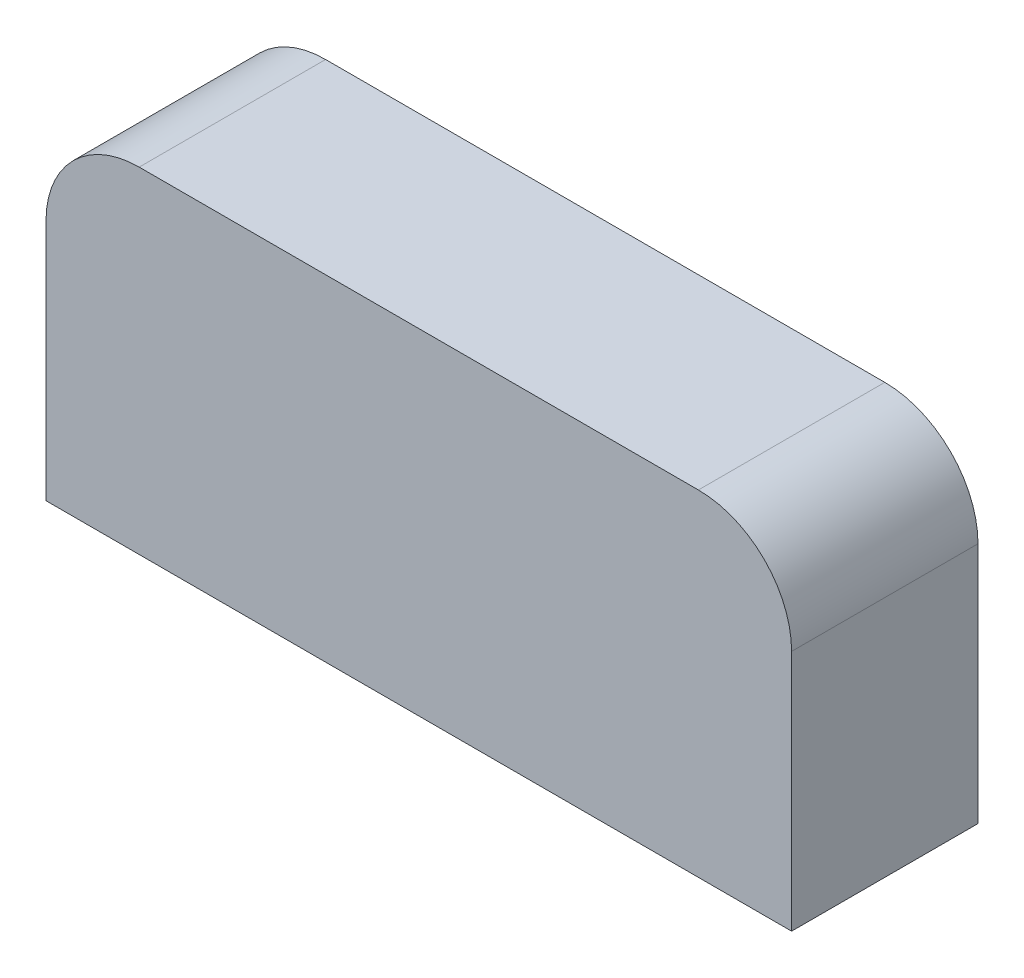
ISO-10303-21;
HEADER;
FILE_DESCRIPTION(('STEP AP214'),'2;1');
FILE_NAME('part.step','',(''),(''),'','','');
FILE_SCHEMA(('AUTOMOTIVE_DESIGN { 1 0 10303 214 1 1 1 1 }'));
ENDSEC;
DATA;
#1=APPLICATION_CONTEXT('core data for automotive mechanical design processes');
#2=APPLICATION_PROTOCOL_DEFINITION('international standard','automotive_design',2000,#1);
#3=PRODUCT_CONTEXT('',#1,'mechanical');
#4=PRODUCT('Part','Part','',(#3));
#5=PRODUCT_RELATED_PRODUCT_CATEGORY('part','',(#4));
#6=PRODUCT_DEFINITION_FORMATION('','',#4);
#7=PRODUCT_DEFINITION_CONTEXT('part definition',#1,'design');
#8=PRODUCT_DEFINITION('design','',#6,#7);
#9=PRODUCT_DEFINITION_SHAPE('','',#8);
#10=(LENGTH_UNIT() NAMED_UNIT(*) SI_UNIT(.MILLI.,.METRE.));
#11=(NAMED_UNIT(*) PLANE_ANGLE_UNIT() SI_UNIT($,.RADIAN.));
#12=(NAMED_UNIT(*) SI_UNIT($,.STERADIAN.) SOLID_ANGLE_UNIT());
#13=UNCERTAINTY_MEASURE_WITH_UNIT(LENGTH_MEASURE(1.E-05),#10,'distance_accuracy_value','');
#14=(GEOMETRIC_REPRESENTATION_CONTEXT(3) GLOBAL_UNCERTAINTY_ASSIGNED_CONTEXT((#13)) GLOBAL_UNIT_ASSIGNED_CONTEXT((#10,
#11,#12)) REPRESENTATION_CONTEXT('',''));
#15=CARTESIAN_POINT('',(0.,0.,0.));
#16=DIRECTION('',(0.,0.,1.));
#17=DIRECTION('',(1.,0.,0.));
#18=AXIS2_PLACEMENT_3D('',#15,#16,#17);
#19=CARTESIAN_POINT('',(0.,0.,-25.4));
#20=DIRECTION('',(0.,0.,1.));
#21=DIRECTION('',(1.,0.,0.));
#22=AXIS2_PLACEMENT_3D('',#19,#20,#21);
#23=PLANE('',#22);
#24=DIRECTION('',(1.,0.,0.));
#25=VECTOR('',#24,1.);
#26=CARTESIAN_POINT('',(50.8,47.625,-25.4));
#27=LINE('',#26,#25);
#28=CARTESIAN_POINT('',(-38.1,47.625,-25.4));
#29=VERTEX_POINT('',#28);
#30=CARTESIAN_POINT('',(38.1,47.625,-25.4));
#31=VERTEX_POINT('',#30);
#32=EDGE_CURVE('E199',#29,#31,#27,.T.);
#33=ORIENTED_EDGE('',*,*,#32,.F.);
#34=CARTESIAN_POINT('',(-38.1,38.1,-25.4));
#35=DIRECTION('',(0.,0.,1.));
#36=DIRECTION('',(1.,0.,0.));
#37=AXIS2_PLACEMENT_3D('',#34,#35,#36);
#38=CIRCLE('',#37,9.525);
#39=CARTESIAN_POINT('',(-47.625,38.1,-25.4));
#40=VERTEX_POINT('',#39);
#41=EDGE_CURVE('E192',#40,#29,#38,.F.);
#42=ORIENTED_EDGE('',*,*,#41,.F.);
#43=DIRECTION('',(0.,1.,0.));
#44=VECTOR('',#43,1.);
#45=CARTESIAN_POINT('',(-47.625,-50.8,-25.4));
#46=LINE('',#45,#44);
#47=CARTESIAN_POINT('',(-47.625,8.25500000000002,-25.4));
#48=VERTEX_POINT('',#47);
#49=EDGE_CURVE('E193',#48,#40,#46,.T.);
#50=ORIENTED_EDGE('',*,*,#49,.F.);
#51=DIRECTION('',(1.,0.,0.));
#52=VECTOR('',#51,1.);
#53=CARTESIAN_POINT('',(-50.810023925187,8.25500000000002,-25.4));
#54=LINE('',#53,#52);
#55=CARTESIAN_POINT('',(47.625,8.25500000000002,-25.4));
#56=VERTEX_POINT('',#55);
#57=EDGE_CURVE('E149',#48,#56,#54,.T.);
#58=ORIENTED_EDGE('',*,*,#57,.T.);
#59=DIRECTION('',(0.,-1.,0.));
#60=VECTOR('',#59,1.);
#61=CARTESIAN_POINT('',(47.625,-50.8,-25.4));
#62=LINE('',#61,#60);
#63=CARTESIAN_POINT('',(47.625,38.1,-25.4));
#64=VERTEX_POINT('',#63);
#65=EDGE_CURVE('E145',#64,#56,#62,.T.);
#66=ORIENTED_EDGE('',*,*,#65,.F.);
#67=CARTESIAN_POINT('',(38.1,38.1,-25.4));
#68=DIRECTION('',(0.,0.,1.));
#69=DIRECTION('',(1.,0.,0.));
#70=AXIS2_PLACEMENT_3D('',#67,#68,#69);
#71=CIRCLE('',#70,9.525);
#72=EDGE_CURVE('E202',#31,#64,#71,.F.);
#73=ORIENTED_EDGE('',*,*,#72,.F.);
#74=EDGE_LOOP('',(#33,#42,#50,#58,#66,#73));
#75=FACE_BOUND('',#74,.T.);
#76=DIRECTION('',(1.,0.,0.));
#77=VECTOR('',#76,1.);
#78=CARTESIAN_POINT('',(50.8,50.8,-25.4));
#79=LINE('',#78,#77);
#80=CARTESIAN_POINT('',(-38.1,50.8,-25.4));
#81=VERTEX_POINT('',#80);
#82=CARTESIAN_POINT('',(38.1,50.8,-25.4));
#83=VERTEX_POINT('',#82);
#84=EDGE_CURVE('E49',#81,#83,#79,.T.);
#85=ORIENTED_EDGE('',*,*,#84,.T.);
#86=CARTESIAN_POINT('',(38.1,38.1,-25.4));
#87=DIRECTION('',(0.,0.,1.));
#88=DIRECTION('',(1.,0.,0.));
#89=AXIS2_PLACEMENT_3D('',#86,#87,#88);
#90=CIRCLE('',#89,12.7);
#91=CARTESIAN_POINT('',(50.8,38.1,-25.4));
#92=VERTEX_POINT('',#91);
#93=EDGE_CURVE('E254',#83,#92,#90,.F.);
#94=ORIENTED_EDGE('',*,*,#93,.T.);
#95=DIRECTION('',(0.,-1.,0.));
#96=VECTOR('',#95,1.);
#97=CARTESIAN_POINT('',(50.8,-50.8,-25.4));
#98=LINE('',#97,#96);
#99=CARTESIAN_POINT('',(50.8,5.08000000000002,-25.4));
#100=VERTEX_POINT('',#99);
#101=EDGE_CURVE('E55',#92,#100,#98,.T.);
#102=ORIENTED_EDGE('',*,*,#101,.T.);
#103=DIRECTION('',(1.,0.,0.));
#104=VECTOR('',#103,1.);
#105=CARTESIAN_POINT('',(-50.810023925187,5.08000000000002,-25.4));
#106=LINE('',#105,#104);
#107=CARTESIAN_POINT('',(-50.8,5.08000000000002,-25.4));
#108=VERTEX_POINT('',#107);
#109=EDGE_CURVE('E245',#108,#100,#106,.T.);
#110=ORIENTED_EDGE('',*,*,#109,.F.);
#111=DIRECTION('',(0.,1.,0.));
#112=VECTOR('',#111,1.);
#113=CARTESIAN_POINT('',(-50.8,-50.8,-25.4));
#114=LINE('',#113,#112);
#115=CARTESIAN_POINT('',(-50.8,38.1,-25.4));
#116=VERTEX_POINT('',#115);
#117=EDGE_CURVE('E11',#108,#116,#114,.T.);
#118=ORIENTED_EDGE('',*,*,#117,.T.);
#119=CARTESIAN_POINT('',(-38.1,38.1,-25.4));
#120=DIRECTION('',(0.,0.,1.));
#121=DIRECTION('',(1.,0.,0.));
#122=AXIS2_PLACEMENT_3D('',#119,#120,#121);
#123=CIRCLE('',#122,12.7);
#124=EDGE_CURVE('E247',#116,#81,#123,.F.);
#125=ORIENTED_EDGE('',*,*,#124,.T.);
#126=EDGE_LOOP('',(#85,#94,#102,#110,#118,#125));
#127=FACE_BOUND('',#126,.T.);
#128=ADVANCED_FACE('F46',(#75,#127),#23,.F.);
#129=CARTESIAN_POINT('',(-50.810023925187,5.08000000000002,0.));
#130=DIRECTION('',(0.,1.,0.));
#131=DIRECTION('',(0.,0.,1.));
#132=AXIS2_PLACEMENT_3D('',#129,#130,#131);
#133=PLANE('',#132);
#134=DIRECTION('',(0.,0.,-1.));
#135=VECTOR('',#134,1.);
#136=CARTESIAN_POINT('',(-50.8,5.08000000000002,-381.1016));
#137=LINE('',#136,#135);
#138=CARTESIAN_POINT('',(-50.8,5.08000000000002,0.));
#139=VERTEX_POINT('',#138);
#140=EDGE_CURVE('E246',#139,#108,#137,.T.);
#141=ORIENTED_EDGE('',*,*,#140,.T.);
#142=ORIENTED_EDGE('',*,*,#109,.T.);
#143=DIRECTION('',(0.,0.,1.));
#144=VECTOR('',#143,1.);
#145=CARTESIAN_POINT('',(50.8,5.08000000000002,-381.1016));
#146=LINE('',#145,#144);
#147=CARTESIAN_POINT('',(50.8,5.08000000000002,0.));
#148=VERTEX_POINT('',#147);
#149=EDGE_CURVE('E242',#100,#148,#146,.T.);
#150=ORIENTED_EDGE('',*,*,#149,.T.);
#151=DIRECTION('',(1.,0.,0.));
#152=VECTOR('',#151,1.);
#153=CARTESIAN_POINT('',(-50.810023925187,5.08000000000002,0.));
#154=LINE('',#153,#152);
#155=EDGE_CURVE('E237',#139,#148,#154,.T.);
#156=ORIENTED_EDGE('',*,*,#155,.F.);
#157=EDGE_LOOP('',(#141,#142,#150,#156));
#158=FACE_BOUND('',#157,.T.);
#159=ADVANCED_FACE('F282',(#158),#133,.F.);
#160=CARTESIAN_POINT('',(-38.1,38.1,-381.1016));
#161=DIRECTION('',(0.,0.,1.));
#162=DIRECTION('',(1.,0.,0.));
#163=AXIS2_PLACEMENT_3D('',#160,#161,#162);
#164=CYLINDRICAL_SURFACE('',#163,12.7);
#165=ORIENTED_EDGE('',*,*,#124,.F.);
#166=DIRECTION('',(0.,0.,1.));
#167=VECTOR('',#166,1.);
#168=CARTESIAN_POINT('',(-50.8,38.1,-381.1016));
#169=LINE('',#168,#167);
#170=CARTESIAN_POINT('',(-50.8,38.1,0.));
#171=VERTEX_POINT('',#170);
#172=EDGE_CURVE('E218',#171,#116,#169,.F.);
#173=ORIENTED_EDGE('',*,*,#172,.F.);
#174=CARTESIAN_POINT('',(-38.1,38.1,0.));
#175=DIRECTION('',(0.,0.,1.));
#176=DIRECTION('',(1.,0.,0.));
#177=AXIS2_PLACEMENT_3D('',#174,#175,#176);
#178=CIRCLE('',#177,12.7);
#179=CARTESIAN_POINT('',(-38.1,50.8,0.));
#180=VERTEX_POINT('',#179);
#181=EDGE_CURVE('E224',#180,#171,#178,.T.);
#182=ORIENTED_EDGE('',*,*,#181,.F.);
#183=DIRECTION('',(0.,0.,1.));
#184=VECTOR('',#183,1.);
#185=CARTESIAN_POINT('',(-38.1,50.8,-381.1016));
#186=LINE('',#185,#184);
#187=EDGE_CURVE('E231',#81,#180,#186,.T.);
#188=ORIENTED_EDGE('',*,*,#187,.F.);
#189=EDGE_LOOP('',(#165,#173,#182,#188));
#190=FACE_BOUND('',#189,.T.);
#191=ADVANCED_FACE('F287',(#190),#164,.T.);
#192=CARTESIAN_POINT('',(50.8,50.8,-381.1016));
#193=DIRECTION('',(0.,1.,0.));
#194=DIRECTION('',(-1.,0.,0.));
#195=AXIS2_PLACEMENT_3D('',#192,#193,#194);
#196=PLANE('',#195);
#197=ORIENTED_EDGE('',*,*,#84,.F.);
#198=ORIENTED_EDGE('',*,*,#187,.T.);
#199=DIRECTION('',(-1.,0.,0.));
#200=VECTOR('',#199,1.);
#201=CARTESIAN_POINT('',(50.8,50.8,0.));
#202=LINE('',#201,#200);
#203=CARTESIAN_POINT('',(38.1,50.8,0.));
#204=VERTEX_POINT('',#203);
#205=EDGE_CURVE('E214',#204,#180,#202,.T.);
#206=ORIENTED_EDGE('',*,*,#205,.F.);
#207=DIRECTION('',(0.,0.,1.));
#208=VECTOR('',#207,1.);
#209=CARTESIAN_POINT('',(38.1,50.8,-381.1016));
#210=LINE('',#209,#208);
#211=EDGE_CURVE('E227',#204,#83,#210,.F.);
#212=ORIENTED_EDGE('',*,*,#211,.T.);
#213=EDGE_LOOP('',(#197,#198,#206,#212));
#214=FACE_BOUND('',#213,.T.);
#215=ADVANCED_FACE('F266',(#214),#196,.T.);
#216=CARTESIAN_POINT('',(38.1,38.1,-381.1016));
#217=DIRECTION('',(0.,0.,1.));
#218=DIRECTION('',(1.,0.,0.));
#219=AXIS2_PLACEMENT_3D('',#216,#217,#218);
#220=CYLINDRICAL_SURFACE('',#219,12.7);
#221=ORIENTED_EDGE('',*,*,#93,.F.);
#222=ORIENTED_EDGE('',*,*,#211,.F.);
#223=CARTESIAN_POINT('',(38.1,38.1,0.));
#224=DIRECTION('',(0.,0.,1.));
#225=DIRECTION('',(1.,0.,0.));
#226=AXIS2_PLACEMENT_3D('',#223,#224,#225);
#227=CIRCLE('',#226,12.7);
#228=CARTESIAN_POINT('',(50.8,38.1,0.));
#229=VERTEX_POINT('',#228);
#230=EDGE_CURVE('E221',#229,#204,#227,.T.);
#231=ORIENTED_EDGE('',*,*,#230,.F.);
#232=DIRECTION('',(0.,0.,1.));
#233=VECTOR('',#232,1.);
#234=CARTESIAN_POINT('',(50.8,38.1,-381.1016));
#235=LINE('',#234,#233);
#236=EDGE_CURVE('E234',#92,#229,#235,.T.);
#237=ORIENTED_EDGE('',*,*,#236,.F.);
#238=EDGE_LOOP('',(#221,#222,#231,#237));
#239=FACE_BOUND('',#238,.T.);
#240=ADVANCED_FACE('F269',(#239),#220,.T.);
#241=CARTESIAN_POINT('',(50.8,-50.8,-381.1016));
#242=DIRECTION('',(1.,0.,0.));
#243=DIRECTION('',(0.,0.,-1.));
#244=AXIS2_PLACEMENT_3D('',#241,#242,#243);
#245=PLANE('',#244);
#246=ORIENTED_EDGE('',*,*,#101,.F.);
#247=ORIENTED_EDGE('',*,*,#236,.T.);
#248=DIRECTION('',(0.,1.,0.));
#249=VECTOR('',#248,1.);
#250=CARTESIAN_POINT('',(50.8,-50.8,0.));
#251=LINE('',#250,#249);
#252=EDGE_CURVE('E210',#148,#229,#251,.T.);
#253=ORIENTED_EDGE('',*,*,#252,.F.);
#254=ORIENTED_EDGE('',*,*,#149,.F.);
#255=EDGE_LOOP('',(#246,#247,#253,#254));
#256=FACE_BOUND('',#255,.T.);
#257=ADVANCED_FACE('F272',(#256),#245,.T.);
#258=CARTESIAN_POINT('',(-50.8,-50.8,-381.1016));
#259=DIRECTION('',(-1.,0.,0.));
#260=DIRECTION('',(0.,0.,1.));
#261=AXIS2_PLACEMENT_3D('',#258,#259,#260);
#262=PLANE('',#261);
#263=ORIENTED_EDGE('',*,*,#117,.F.);
#264=ORIENTED_EDGE('',*,*,#140,.F.);
#265=DIRECTION('',(0.,-1.,0.));
#266=VECTOR('',#265,1.);
#267=CARTESIAN_POINT('',(-50.8,-50.8,0.));
#268=LINE('',#267,#266);
#269=EDGE_CURVE('E196',#171,#139,#268,.T.);
#270=ORIENTED_EDGE('',*,*,#269,.F.);
#271=ORIENTED_EDGE('',*,*,#172,.T.);
#272=EDGE_LOOP('',(#263,#264,#270,#271));
#273=FACE_BOUND('',#272,.T.);
#274=ADVANCED_FACE('F283',(#273),#262,.T.);
#275=CARTESIAN_POINT('',(0.,0.,0.));
#276=DIRECTION('',(0.,0.,1.));
#277=DIRECTION('',(1.,0.,0.));
#278=AXIS2_PLACEMENT_3D('',#275,#276,#277);
#279=PLANE('',#278);
#280=ORIENTED_EDGE('',*,*,#269,.T.);
#281=ORIENTED_EDGE('',*,*,#155,.T.);
#282=ORIENTED_EDGE('',*,*,#252,.T.);
#283=ORIENTED_EDGE('',*,*,#230,.T.);
#284=ORIENTED_EDGE('',*,*,#205,.T.);
#285=ORIENTED_EDGE('',*,*,#181,.T.);
#286=EDGE_LOOP('',(#280,#281,#282,#283,#284,#285));
#287=FACE_BOUND('',#286,.T.);
#288=ADVANCED_FACE('F276',(#287),#279,.T.);
#289=CARTESIAN_POINT('',(-50.810023925187,8.25500000000002,0.));
#290=DIRECTION('',(0.,1.,0.));
#291=DIRECTION('',(0.,0.,1.));
#292=AXIS2_PLACEMENT_3D('',#289,#290,#291);
#293=PLANE('',#292);
#294=DIRECTION('',(0.,0.,-1.));
#295=VECTOR('',#294,1.);
#296=CARTESIAN_POINT('',(-47.625,8.25500000000003,-381.1016));
#297=LINE('',#296,#295);
#298=CARTESIAN_POINT('',(-47.625,8.25500000000002,-3.175));
#299=VERTEX_POINT('',#298);
#300=EDGE_CURVE('E150',#299,#48,#297,.T.);
#301=ORIENTED_EDGE('',*,*,#300,.F.);
#302=DIRECTION('',(1.,0.,0.));
#303=VECTOR('',#302,1.);
#304=CARTESIAN_POINT('',(-50.810023925187,8.25500000000002,-3.175));
#305=LINE('',#304,#303);
#306=CARTESIAN_POINT('',(47.625,8.25500000000002,-3.175));
#307=VERTEX_POINT('',#306);
#308=EDGE_CURVE('E153',#299,#307,#305,.T.);
#309=ORIENTED_EDGE('',*,*,#308,.T.);
#310=DIRECTION('',(0.,0.,1.));
#311=VECTOR('',#310,1.);
#312=CARTESIAN_POINT('',(47.625,8.25500000000003,-381.1016));
#313=LINE('',#312,#311);
#314=EDGE_CURVE('E137',#56,#307,#313,.T.);
#315=ORIENTED_EDGE('',*,*,#314,.F.);
#316=ORIENTED_EDGE('',*,*,#57,.F.);
#317=EDGE_LOOP('',(#301,#309,#315,#316));
#318=FACE_BOUND('',#317,.T.);
#319=ADVANCED_FACE('F154',(#318),#293,.T.);
#320=CARTESIAN_POINT('',(-38.1,38.1,-381.1016));
#321=DIRECTION('',(0.,0.,1.));
#322=DIRECTION('',(1.,0.,0.));
#323=AXIS2_PLACEMENT_3D('',#320,#321,#322);
#324=CYLINDRICAL_SURFACE('',#323,9.525);
#325=ORIENTED_EDGE('',*,*,#41,.T.);
#326=DIRECTION('',(0.,0.,1.));
#327=VECTOR('',#326,1.);
#328=CARTESIAN_POINT('',(-38.1,47.625,-381.1016));
#329=LINE('',#328,#327);
#330=CARTESIAN_POINT('',(-38.1,47.625,-3.17499999999998));
#331=VERTEX_POINT('',#330);
#332=EDGE_CURVE('E180',#29,#331,#329,.T.);
#333=ORIENTED_EDGE('',*,*,#332,.T.);
#334=CARTESIAN_POINT('',(-38.1,38.1,-3.17499999999998));
#335=DIRECTION('',(0.,0.,1.));
#336=DIRECTION('',(1.,0.,0.));
#337=AXIS2_PLACEMENT_3D('',#334,#335,#336);
#338=CIRCLE('',#337,9.525);
#339=CARTESIAN_POINT('',(-47.625,38.1,-3.17499999999998));
#340=VERTEX_POINT('',#339);
#341=EDGE_CURVE('E181',#331,#340,#338,.T.);
#342=ORIENTED_EDGE('',*,*,#341,.T.);
#343=DIRECTION('',(0.,0.,1.));
#344=VECTOR('',#343,1.);
#345=CARTESIAN_POINT('',(-47.625,38.1,-381.1016));
#346=LINE('',#345,#344);
#347=EDGE_CURVE('E63',#340,#40,#346,.F.);
#348=ORIENTED_EDGE('',*,*,#347,.T.);
#349=EDGE_LOOP('',(#325,#333,#342,#348));
#350=FACE_BOUND('',#349,.T.);
#351=ADVANCED_FACE('F297',(#350),#324,.F.);
#352=CARTESIAN_POINT('',(50.8,47.625,-381.1016));
#353=DIRECTION('',(0.,1.,0.));
#354=DIRECTION('',(-1.,0.,0.));
#355=AXIS2_PLACEMENT_3D('',#352,#353,#354);
#356=PLANE('',#355);
#357=ORIENTED_EDGE('',*,*,#32,.T.);
#358=DIRECTION('',(0.,0.,1.));
#359=VECTOR('',#358,1.);
#360=CARTESIAN_POINT('',(38.1,47.625,-381.1016));
#361=LINE('',#360,#359);
#362=CARTESIAN_POINT('',(38.1,47.625,-3.17499999999998));
#363=VERTEX_POINT('',#362);
#364=EDGE_CURVE('E176',#363,#31,#361,.F.);
#365=ORIENTED_EDGE('',*,*,#364,.F.);
#366=DIRECTION('',(-1.,0.,0.));
#367=VECTOR('',#366,1.);
#368=CARTESIAN_POINT('',(0.,47.625,-3.175));
#369=LINE('',#368,#367);
#370=EDGE_CURVE('E166',#363,#331,#369,.T.);
#371=ORIENTED_EDGE('',*,*,#370,.T.);
#372=ORIENTED_EDGE('',*,*,#332,.F.);
#373=EDGE_LOOP('',(#357,#365,#371,#372));
#374=FACE_BOUND('',#373,.T.);
#375=ADVANCED_FACE('F313',(#374),#356,.F.);
#376=CARTESIAN_POINT('',(38.1,38.1,-381.1016));
#377=DIRECTION('',(0.,0.,1.));
#378=DIRECTION('',(1.,0.,0.));
#379=AXIS2_PLACEMENT_3D('',#376,#377,#378);
#380=CYLINDRICAL_SURFACE('',#379,9.525);
#381=ORIENTED_EDGE('',*,*,#72,.T.);
#382=DIRECTION('',(0.,0.,-1.));
#383=VECTOR('',#382,1.);
#384=CARTESIAN_POINT('',(47.625,38.1,-381.1016));
#385=LINE('',#384,#383);
#386=CARTESIAN_POINT('',(47.625,38.1,-3.17499999999998));
#387=VERTEX_POINT('',#386);
#388=EDGE_CURVE('E160',#64,#387,#385,.F.);
#389=ORIENTED_EDGE('',*,*,#388,.T.);
#390=CARTESIAN_POINT('',(38.1,38.1,-3.17499999999998));
#391=DIRECTION('',(0.,0.,1.));
#392=DIRECTION('',(1.,0.,0.));
#393=AXIS2_PLACEMENT_3D('',#390,#391,#392);
#394=CIRCLE('',#393,9.525);
#395=EDGE_CURVE('E164',#387,#363,#394,.T.);
#396=ORIENTED_EDGE('',*,*,#395,.T.);
#397=ORIENTED_EDGE('',*,*,#364,.T.);
#398=EDGE_LOOP('',(#381,#389,#396,#397));
#399=FACE_BOUND('',#398,.T.);
#400=ADVANCED_FACE('F315',(#399),#380,.F.);
#401=CARTESIAN_POINT('',(47.625,-50.8,-381.1016));
#402=DIRECTION('',(1.,0.,0.));
#403=DIRECTION('',(0.,0.,-1.));
#404=AXIS2_PLACEMENT_3D('',#401,#402,#403);
#405=PLANE('',#404);
#406=ORIENTED_EDGE('',*,*,#65,.T.);
#407=ORIENTED_EDGE('',*,*,#314,.T.);
#408=DIRECTION('',(0.,1.,0.));
#409=VECTOR('',#408,1.);
#410=CARTESIAN_POINT('',(47.625,0.,-3.175));
#411=LINE('',#410,#409);
#412=EDGE_CURVE('E142',#307,#387,#411,.T.);
#413=ORIENTED_EDGE('',*,*,#412,.T.);
#414=ORIENTED_EDGE('',*,*,#388,.F.);
#415=EDGE_LOOP('',(#406,#407,#413,#414));
#416=FACE_BOUND('',#415,.T.);
#417=ADVANCED_FACE('F139',(#416),#405,.F.);
#418=CARTESIAN_POINT('',(-47.625,-50.8,-381.1016));
#419=DIRECTION('',(-1.,0.,0.));
#420=DIRECTION('',(0.,0.,1.));
#421=AXIS2_PLACEMENT_3D('',#418,#419,#420);
#422=PLANE('',#421);
#423=ORIENTED_EDGE('',*,*,#49,.T.);
#424=ORIENTED_EDGE('',*,*,#347,.F.);
#425=DIRECTION('',(0.,-1.,0.));
#426=VECTOR('',#425,1.);
#427=CARTESIAN_POINT('',(-47.625,0.,-3.175));
#428=LINE('',#427,#426);
#429=EDGE_CURVE('E167',#340,#299,#428,.T.);
#430=ORIENTED_EDGE('',*,*,#429,.T.);
#431=ORIENTED_EDGE('',*,*,#300,.T.);
#432=EDGE_LOOP('',(#423,#424,#430,#431));
#433=FACE_BOUND('',#432,.T.);
#434=ADVANCED_FACE('F329',(#433),#422,.F.);
#435=CARTESIAN_POINT('',(0.,0.,-3.175));
#436=DIRECTION('',(0.,0.,1.));
#437=DIRECTION('',(1.,0.,0.));
#438=AXIS2_PLACEMENT_3D('',#435,#436,#437);
#439=PLANE('',#438);
#440=ORIENTED_EDGE('',*,*,#429,.F.);
#441=ORIENTED_EDGE('',*,*,#341,.F.);
#442=ORIENTED_EDGE('',*,*,#370,.F.);
#443=ORIENTED_EDGE('',*,*,#395,.F.);
#444=ORIENTED_EDGE('',*,*,#412,.F.);
#445=ORIENTED_EDGE('',*,*,#308,.F.);
#446=EDGE_LOOP('',(#440,#441,#442,#443,#444,#445));
#447=FACE_BOUND('',#446,.T.);
#448=ADVANCED_FACE('F162',(#447),#439,.F.);
#449=CLOSED_SHELL('',(#128,#159,#191,#215,#240,#257,#274,#288,#319,#351,#375,#400,#417,#434,#448));
#450=MANIFOLD_SOLID_BREP('B2',#449);
#451=ADVANCED_BREP_SHAPE_REPRESENTATION('',(#18,#450),#14);
#452=SHAPE_DEFINITION_REPRESENTATION(#9,#451);
ENDSEC;
END-ISO-10303-21;
